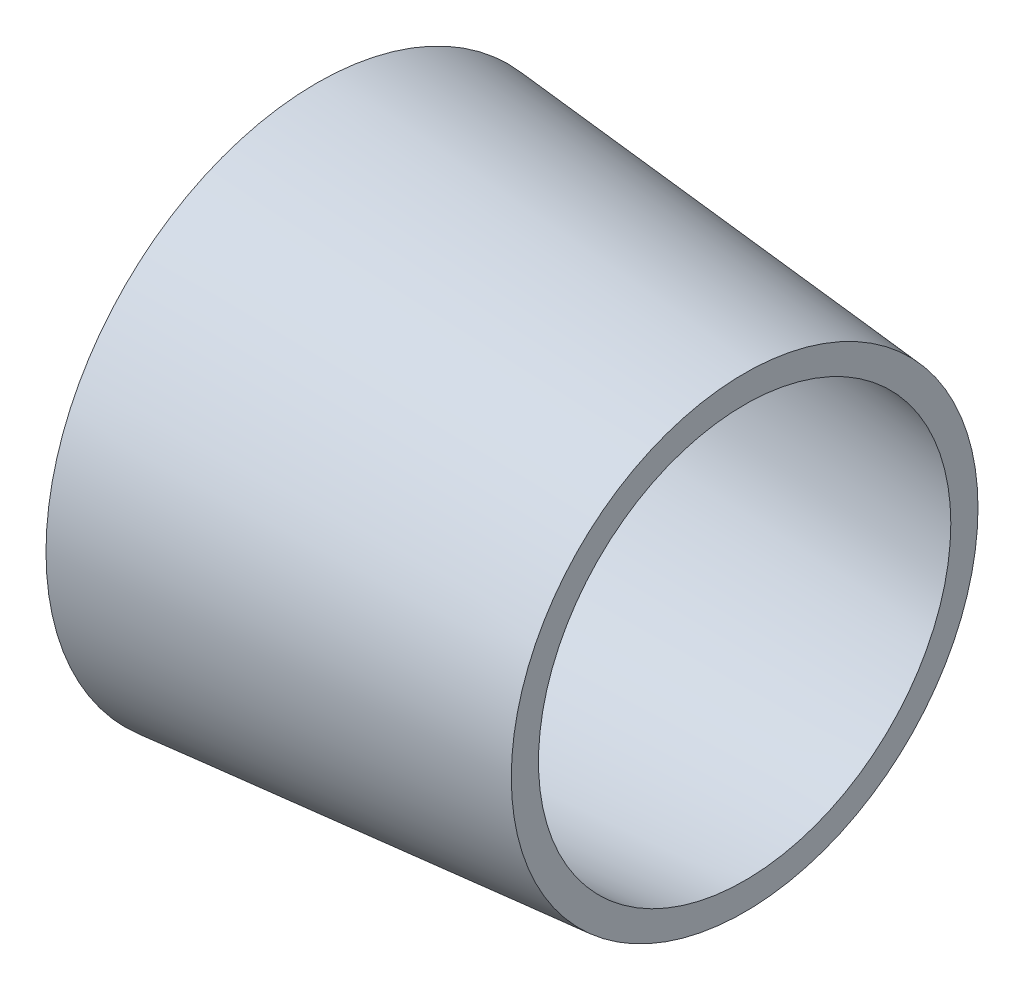
ISO-10303-21;
HEADER;
FILE_DESCRIPTION(('STEP AP214'),'2;1');
FILE_NAME('part.step','',(''),(''),'','','');
FILE_SCHEMA(('AUTOMOTIVE_DESIGN { 1 0 10303 214 1 1 1 1 }'));
ENDSEC;
DATA;
#1=APPLICATION_CONTEXT('core data for automotive mechanical design processes');
#2=APPLICATION_PROTOCOL_DEFINITION('international standard','automotive_design',2000,#1);
#3=PRODUCT_CONTEXT('',#1,'mechanical');
#4=PRODUCT('Part','Part','',(#3));
#5=PRODUCT_RELATED_PRODUCT_CATEGORY('part','',(#4));
#6=PRODUCT_DEFINITION_FORMATION('','',#4);
#7=PRODUCT_DEFINITION_CONTEXT('part definition',#1,'design');
#8=PRODUCT_DEFINITION('design','',#6,#7);
#9=PRODUCT_DEFINITION_SHAPE('','',#8);
#10=(LENGTH_UNIT() NAMED_UNIT(*) SI_UNIT(.MILLI.,.METRE.));
#11=(NAMED_UNIT(*) PLANE_ANGLE_UNIT() SI_UNIT($,.RADIAN.));
#12=(NAMED_UNIT(*) SI_UNIT($,.STERADIAN.) SOLID_ANGLE_UNIT());
#13=UNCERTAINTY_MEASURE_WITH_UNIT(LENGTH_MEASURE(1.E-05),#10,'distance_accuracy_value','');
#14=(GEOMETRIC_REPRESENTATION_CONTEXT(3) GLOBAL_UNCERTAINTY_ASSIGNED_CONTEXT((#13)) GLOBAL_UNIT_ASSIGNED_CONTEXT((#10,
#11,#12)) REPRESENTATION_CONTEXT('',''));
#15=CARTESIAN_POINT('',(0.,0.,0.));
#16=DIRECTION('',(0.,0.,1.));
#17=DIRECTION('',(1.,0.,0.));
#18=AXIS2_PLACEMENT_3D('',#15,#16,#17);
#19=CARTESIAN_POINT('',(-262.93749149716,0.,0.));
#20=DIRECTION('',(-1.,0.,0.));
#21=DIRECTION('',(0.,0.,-1.));
#22=AXIS2_PLACEMENT_3D('',#19,#20,#21);
#23=CONICAL_SURFACE('',#22,457.2,0.0872664625997167);
#24=CARTESIAN_POINT('',(459.43850850284,0.,0.));
#25=DIRECTION('',(1.,0.,0.));
#26=DIRECTION('',(0.,0.,-1.));
#27=AXIS2_PLACEMENT_3D('',#24,#25,#26);
#28=CIRCLE('',#27,394.000289196797);
#29=CARTESIAN_POINT('',(459.43850850284,0.,-394.000289196797));
#30=VERTEX_POINT('',#29);
#31=EDGE_CURVE('E10',#30,#30,#28,.T.);
#32=ORIENTED_EDGE('',*,*,#31,.F.);
#33=EDGE_LOOP('',(#32));
#34=FACE_BOUND('',#33,.T.);
#35=CARTESIAN_POINT('',(-262.93749149716,0.,0.));
#36=DIRECTION('',(1.,0.,0.));
#37=DIRECTION('',(0.,0.,-1.));
#38=AXIS2_PLACEMENT_3D('',#35,#36,#37);
#39=CIRCLE('',#38,457.2);
#40=CARTESIAN_POINT('',(-262.93749149716,0.,-457.2));
#41=VERTEX_POINT('',#40);
#42=EDGE_CURVE('E43',#41,#41,#39,.T.);
#43=ORIENTED_EDGE('',*,*,#42,.T.);
#44=EDGE_LOOP('',(#43));
#45=FACE_BOUND('',#44,.T.);
#46=ADVANCED_FACE('F37',(#34,#45),#23,.T.);
#47=CARTESIAN_POINT('',(459.43850850284,0.,0.));
#48=DIRECTION('',(1.,0.,0.));
#49=DIRECTION('',(0.,0.,-1.));
#50=AXIS2_PLACEMENT_3D('',#47,#48,#49);
#51=PLANE('',#50);
#52=CARTESIAN_POINT('',(459.43850850284,0.,0.));
#53=DIRECTION('',(1.,0.,0.));
#54=DIRECTION('',(0.,0.,-1.));
#55=AXIS2_PLACEMENT_3D('',#52,#53,#54);
#56=CIRCLE('',#55,348.105646224315);
#57=CARTESIAN_POINT('',(459.43850850284,0.,-348.105646224315));
#58=VERTEX_POINT('',#57);
#59=EDGE_CURVE('E47',#58,#58,#56,.T.);
#60=ORIENTED_EDGE('',*,*,#59,.F.);
#61=EDGE_LOOP('',(#60));
#62=FACE_BOUND('',#61,.T.);
#63=ORIENTED_EDGE('',*,*,#31,.T.);
#64=EDGE_LOOP('',(#63));
#65=FACE_BOUND('',#64,.T.);
#66=ADVANCED_FACE('F69',(#62,#65),#51,.T.);
#67=CARTESIAN_POINT('',(-262.93749149716,0.,0.));
#68=DIRECTION('',(1.,0.,0.));
#69=DIRECTION('',(0.,0.,-1.));
#70=AXIS2_PLACEMENT_3D('',#67,#68,#69);
#71=PLANE('',#70);
#72=ORIENTED_EDGE('',*,*,#42,.F.);
#73=EDGE_LOOP('',(#72));
#74=FACE_BOUND('',#73,.T.);
#75=ADVANCED_FACE('F61',(#74),#71,.F.);
#76=CARTESIAN_POINT('',(-266.922252055583,0.,0.));
#77=DIRECTION('',(-1.,0.,0.));
#78=DIRECTION('',(0.,0.,-1.));
#79=AXIS2_PLACEMENT_3D('',#76,#77,#78);
#80=CONICAL_SURFACE('',#79,411.653978403245,0.0872664625997167);
#81=ORIENTED_EDGE('',*,*,#59,.T.);
#82=EDGE_LOOP('',(#81));
#83=FACE_BOUND('',#82,.T.);
#84=CARTESIAN_POINT('',(-217.21749149716,0.,0.));
#85=DIRECTION('',(1.,0.,0.));
#86=DIRECTION('',(0.,0.,-1.));
#87=AXIS2_PLACEMENT_3D('',#84,#85,#86);
#88=CIRCLE('',#87,407.305375331113);
#89=CARTESIAN_POINT('',(-217.21749149716,0.,-407.305375331113));
#90=VERTEX_POINT('',#89);
#91=EDGE_CURVE('E51',#90,#90,#88,.T.);
#92=ORIENTED_EDGE('',*,*,#91,.F.);
#93=EDGE_LOOP('',(#92));
#94=FACE_BOUND('',#93,.T.);
#95=ADVANCED_FACE('F59',(#83,#94),#80,.F.);
#96=CARTESIAN_POINT('',(-217.21749149716,0.,0.));
#97=DIRECTION('',(1.,0.,0.));
#98=DIRECTION('',(0.,0.,-1.));
#99=AXIS2_PLACEMENT_3D('',#96,#97,#98);
#100=PLANE('',#99);
#101=ORIENTED_EDGE('',*,*,#91,.T.);
#102=EDGE_LOOP('',(#101));
#103=FACE_BOUND('',#102,.T.);
#104=ADVANCED_FACE('F57',(#103),#100,.T.);
#105=CLOSED_SHELL('',(#46,#66,#75,#95,#104));
#106=MANIFOLD_SOLID_BREP('B2',#105);
#107=ADVANCED_BREP_SHAPE_REPRESENTATION('',(#18,#106),#14);
#108=SHAPE_DEFINITION_REPRESENTATION(#9,#107);
ENDSEC;
END-ISO-10303-21;
